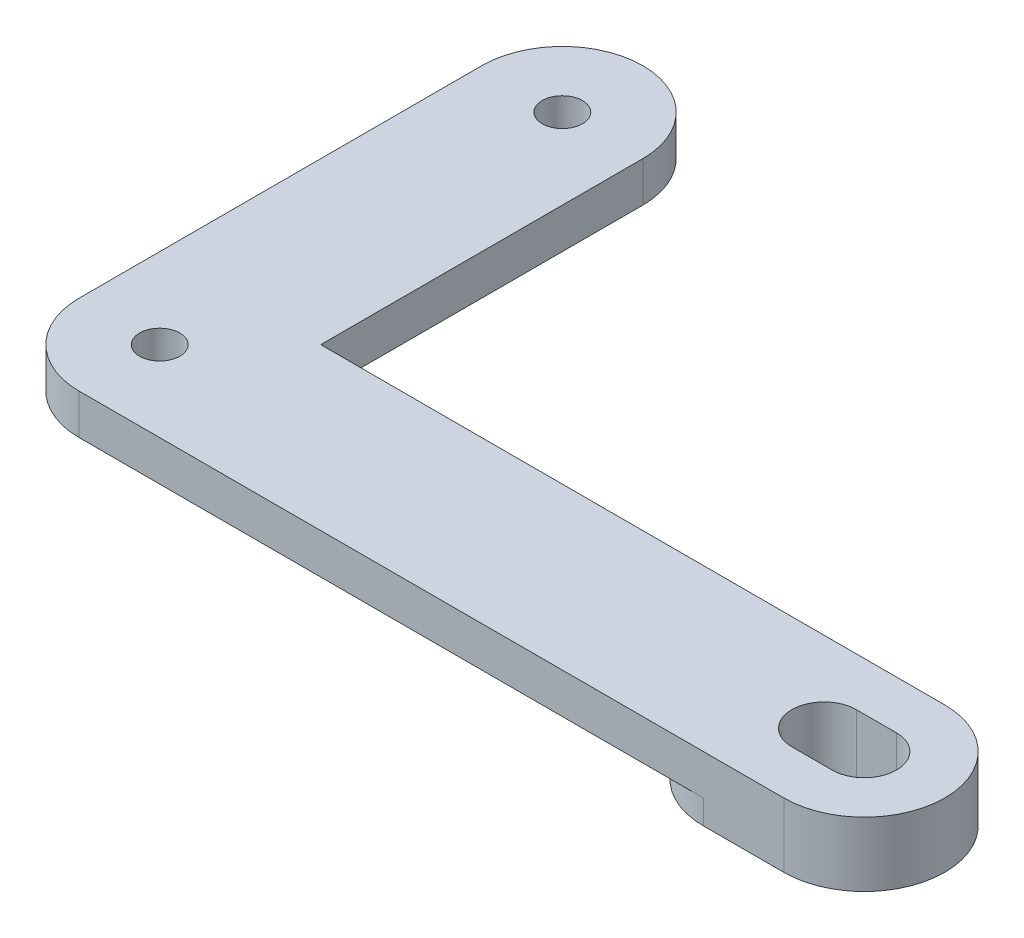
ISO-10303-21;
HEADER;
FILE_DESCRIPTION(('STEP AP214'),'2;1');
FILE_NAME('part.step','',(''),(''),'','','');
FILE_SCHEMA(('AUTOMOTIVE_DESIGN { 1 0 10303 214 1 1 1 1 }'));
ENDSEC;
DATA;
#1=APPLICATION_CONTEXT('core data for automotive mechanical design processes');
#2=APPLICATION_PROTOCOL_DEFINITION('international standard','automotive_design',2000,#1);
#3=PRODUCT_CONTEXT('',#1,'mechanical');
#4=PRODUCT('Part','Part','',(#3));
#5=PRODUCT_RELATED_PRODUCT_CATEGORY('part','',(#4));
#6=PRODUCT_DEFINITION_FORMATION('','',#4);
#7=PRODUCT_DEFINITION_CONTEXT('part definition',#1,'design');
#8=PRODUCT_DEFINITION('design','',#6,#7);
#9=PRODUCT_DEFINITION_SHAPE('','',#8);
#10=(LENGTH_UNIT() NAMED_UNIT(*) SI_UNIT(.MILLI.,.METRE.));
#11=(NAMED_UNIT(*) PLANE_ANGLE_UNIT() SI_UNIT($,.RADIAN.));
#12=(NAMED_UNIT(*) SI_UNIT($,.STERADIAN.) SOLID_ANGLE_UNIT());
#13=UNCERTAINTY_MEASURE_WITH_UNIT(LENGTH_MEASURE(1.E-05),#10,'distance_accuracy_value','');
#14=(GEOMETRIC_REPRESENTATION_CONTEXT(3) GLOBAL_UNCERTAINTY_ASSIGNED_CONTEXT((#13)) GLOBAL_UNIT_ASSIGNED_CONTEXT((#10,
#11,#12)) REPRESENTATION_CONTEXT('',''));
#15=CARTESIAN_POINT('',(0.,0.,0.));
#16=DIRECTION('',(0.,0.,1.));
#17=DIRECTION('',(1.,0.,0.));
#18=AXIS2_PLACEMENT_3D('',#15,#16,#17);
#19=CARTESIAN_POINT('',(0.,0.,0.));
#20=DIRECTION('',(0.,1.,0.));
#21=DIRECTION('',(0.,0.,1.));
#22=AXIS2_PLACEMENT_3D('',#19,#20,#21);
#23=PLANE('',#22);
#24=CARTESIAN_POINT('',(87.5,0.,0.));
#25=DIRECTION('',(0.,1.,0.));
#26=DIRECTION('',(0.,0.,1.));
#27=AXIS2_PLACEMENT_3D('',#24,#25,#26);
#28=CIRCLE('',#27,4.);
#29=CARTESIAN_POINT('',(87.5,0.,4.));
#30=VERTEX_POINT('',#29);
#31=CARTESIAN_POINT('',(87.5,0.,-4.));
#32=VERTEX_POINT('',#31);
#33=EDGE_CURVE('E56',#30,#32,#28,.T.);
#34=ORIENTED_EDGE('',*,*,#33,.T.);
#35=DIRECTION('',(-1.,0.,0.));
#36=VECTOR('',#35,1.);
#37=CARTESIAN_POINT('',(87.5,0.,-4.));
#38=LINE('',#37,#36);
#39=CARTESIAN_POINT('',(82.5,0.,-4.));
#40=VERTEX_POINT('',#39);
#41=EDGE_CURVE('E205',#32,#40,#38,.T.);
#42=ORIENTED_EDGE('',*,*,#41,.T.);
#43=CARTESIAN_POINT('',(82.5,0.,0.));
#44=DIRECTION('',(0.,1.,0.));
#45=DIRECTION('',(0.,0.,1.));
#46=AXIS2_PLACEMENT_3D('',#43,#44,#45);
#47=CIRCLE('',#46,4.);
#48=CARTESIAN_POINT('',(82.5,0.,4.));
#49=VERTEX_POINT('',#48);
#50=EDGE_CURVE('E208',#40,#49,#47,.T.);
#51=ORIENTED_EDGE('',*,*,#50,.T.);
#52=DIRECTION('',(1.,0.,0.));
#53=VECTOR('',#52,1.);
#54=CARTESIAN_POINT('',(87.5,0.,4.));
#55=LINE('',#54,#53);
#56=EDGE_CURVE('E197',#49,#30,#55,.T.);
#57=ORIENTED_EDGE('',*,*,#56,.T.);
#58=EDGE_LOOP('',(#34,#42,#51,#57));
#59=FACE_BOUND('',#58,.T.);
#60=CARTESIAN_POINT('',(77.5,0.,0.));
#61=DIRECTION('',(0.,-1.,0.));
#62=DIRECTION('',(0.,0.,-1.));
#63=AXIS2_PLACEMENT_3D('',#60,#61,#62);
#64=CIRCLE('',#63,10.);
#65=CARTESIAN_POINT('',(77.5,0.,10.));
#66=VERTEX_POINT('',#65);
#67=CARTESIAN_POINT('',(77.5,0.,-10.));
#68=VERTEX_POINT('',#67);
#69=EDGE_CURVE('E151',#66,#68,#64,.T.);
#70=ORIENTED_EDGE('',*,*,#69,.T.);
#71=DIRECTION('',(-1.,0.,0.));
#72=VECTOR('',#71,1.);
#73=CARTESIAN_POINT('',(0.,0.,-10.));
#74=LINE('',#73,#72);
#75=CARTESIAN_POINT('',(87.5,0.,-10.));
#76=VERTEX_POINT('',#75);
#77=EDGE_CURVE('E156',#76,#68,#74,.T.);
#78=ORIENTED_EDGE('',*,*,#77,.F.);
#79=CARTESIAN_POINT('',(87.5,0.,0.));
#80=DIRECTION('',(0.,1.,0.));
#81=DIRECTION('',(0.,0.,1.));
#82=AXIS2_PLACEMENT_3D('',#79,#80,#81);
#83=CIRCLE('',#82,10.);
#84=CARTESIAN_POINT('',(87.5,0.,10.));
#85=VERTEX_POINT('',#84);
#86=EDGE_CURVE('E235',#85,#76,#83,.T.);
#87=ORIENTED_EDGE('',*,*,#86,.F.);
#88=DIRECTION('',(1.,0.,0.));
#89=VECTOR('',#88,1.);
#90=CARTESIAN_POINT('',(0.,0.,10.));
#91=LINE('',#90,#89);
#92=EDGE_CURVE('E222',#66,#85,#91,.T.);
#93=ORIENTED_EDGE('',*,*,#92,.F.);
#94=EDGE_LOOP('',(#70,#78,#87,#93));
#95=FACE_BOUND('',#94,.T.);
#96=ADVANCED_FACE('F33',(#59,#95),#23,.F.);
#97=CARTESIAN_POINT('',(0.,8.,0.));
#98=DIRECTION('',(0.,1.,0.));
#99=DIRECTION('',(0.,0.,1.));
#100=AXIS2_PLACEMENT_3D('',#97,#98,#99);
#101=PLANE('',#100);
#102=CARTESIAN_POINT('',(0.,8.,0.));
#103=DIRECTION('',(0.,1.,0.));
#104=DIRECTION('',(0.,0.,1.));
#105=AXIS2_PLACEMENT_3D('',#102,#103,#104);
#106=CIRCLE('',#105,10.);
#107=CARTESIAN_POINT('',(-10.,8.,0.));
#108=VERTEX_POINT('',#107);
#109=CARTESIAN_POINT('',(0.,8.,10.));
#110=VERTEX_POINT('',#109);
#111=EDGE_CURVE('E223',#108,#110,#106,.T.);
#112=ORIENTED_EDGE('',*,*,#111,.T.);
#113=DIRECTION('',(1.,0.,0.));
#114=VECTOR('',#113,1.);
#115=CARTESIAN_POINT('',(0.,8.,10.));
#116=LINE('',#115,#114);
#117=CARTESIAN_POINT('',(87.5,8.,10.));
#118=VERTEX_POINT('',#117);
#119=EDGE_CURVE('E225',#110,#118,#116,.T.);
#120=ORIENTED_EDGE('',*,*,#119,.T.);
#121=CARTESIAN_POINT('',(87.5,8.,0.));
#122=DIRECTION('',(0.,1.,0.));
#123=DIRECTION('',(0.,0.,1.));
#124=AXIS2_PLACEMENT_3D('',#121,#122,#123);
#125=CIRCLE('',#124,10.);
#126=CARTESIAN_POINT('',(87.5,8.,-10.));
#127=VERTEX_POINT('',#126);
#128=EDGE_CURVE('E227',#118,#127,#125,.T.);
#129=ORIENTED_EDGE('',*,*,#128,.T.);
#130=DIRECTION('',(-1.,0.,0.));
#131=VECTOR('',#130,1.);
#132=CARTESIAN_POINT('',(0.,8.,-10.));
#133=LINE('',#132,#131);
#134=CARTESIAN_POINT('',(10.,8.,-10.));
#135=VERTEX_POINT('',#134);
#136=EDGE_CURVE('E229',#127,#135,#133,.T.);
#137=ORIENTED_EDGE('',*,*,#136,.T.);
#138=DIRECTION('',(0.,0.,-1.));
#139=VECTOR('',#138,1.);
#140=CARTESIAN_POINT('',(10.,8.,0.));
#141=LINE('',#140,#139);
#142=CARTESIAN_POINT('',(10.,8.,-50.));
#143=VERTEX_POINT('',#142);
#144=EDGE_CURVE('E170',#135,#143,#141,.T.);
#145=ORIENTED_EDGE('',*,*,#144,.T.);
#146=CARTESIAN_POINT('',(0.,8.,-50.));
#147=DIRECTION('',(0.,1.,0.));
#148=DIRECTION('',(0.,0.,1.));
#149=AXIS2_PLACEMENT_3D('',#146,#147,#148);
#150=CIRCLE('',#149,10.);
#151=CARTESIAN_POINT('',(-10.,8.,-50.));
#152=VERTEX_POINT('',#151);
#153=EDGE_CURVE('E183',#143,#152,#150,.T.);
#154=ORIENTED_EDGE('',*,*,#153,.T.);
#155=DIRECTION('',(0.,0.,1.));
#156=VECTOR('',#155,1.);
#157=CARTESIAN_POINT('',(-10.,8.,0.));
#158=LINE('',#157,#156);
#159=EDGE_CURVE('E175',#152,#108,#158,.T.);
#160=ORIENTED_EDGE('',*,*,#159,.T.);
#161=EDGE_LOOP('',(#112,#120,#129,#137,#145,#154,#160));
#162=FACE_BOUND('',#161,.T.);
#163=DIRECTION('',(-1.,0.,0.));
#164=VECTOR('',#163,1.);
#165=CARTESIAN_POINT('',(87.5,8.,-4.));
#166=LINE('',#165,#164);
#167=CARTESIAN_POINT('',(87.5,8.,-4.));
#168=VERTEX_POINT('',#167);
#169=CARTESIAN_POINT('',(82.5,8.,-4.));
#170=VERTEX_POINT('',#169);
#171=EDGE_CURVE('E196',#168,#170,#166,.T.);
#172=ORIENTED_EDGE('',*,*,#171,.F.);
#173=CARTESIAN_POINT('',(87.5,8.,0.));
#174=DIRECTION('',(0.,1.,0.));
#175=DIRECTION('',(0.,0.,1.));
#176=AXIS2_PLACEMENT_3D('',#173,#174,#175);
#177=CIRCLE('',#176,4.);
#178=CARTESIAN_POINT('',(87.5,8.,4.));
#179=VERTEX_POINT('',#178);
#180=EDGE_CURVE('E194',#179,#168,#177,.T.);
#181=ORIENTED_EDGE('',*,*,#180,.F.);
#182=DIRECTION('',(1.,0.,0.));
#183=VECTOR('',#182,1.);
#184=CARTESIAN_POINT('',(87.5,8.,4.));
#185=LINE('',#184,#183);
#186=CARTESIAN_POINT('',(82.5,8.,4.));
#187=VERTEX_POINT('',#186);
#188=EDGE_CURVE('E201',#187,#179,#185,.T.);
#189=ORIENTED_EDGE('',*,*,#188,.F.);
#190=CARTESIAN_POINT('',(82.5,8.,0.));
#191=DIRECTION('',(0.,1.,0.));
#192=DIRECTION('',(0.,0.,1.));
#193=AXIS2_PLACEMENT_3D('',#190,#191,#192);
#194=CIRCLE('',#193,4.);
#195=EDGE_CURVE('E199',#170,#187,#194,.T.);
#196=ORIENTED_EDGE('',*,*,#195,.F.);
#197=EDGE_LOOP('',(#172,#181,#189,#196));
#198=FACE_BOUND('',#197,.T.);
#199=CARTESIAN_POINT('',(0.,8.,0.));
#200=DIRECTION('',(0.,1.,0.));
#201=DIRECTION('',(0.,0.,1.));
#202=AXIS2_PLACEMENT_3D('',#199,#200,#201);
#203=CIRCLE('',#202,2.5);
#204=CARTESIAN_POINT('',(0.,8.,2.5));
#205=VERTEX_POINT('',#204);
#206=EDGE_CURVE('E219',#205,#205,#203,.T.);
#207=ORIENTED_EDGE('',*,*,#206,.F.);
#208=EDGE_LOOP('',(#207));
#209=FACE_BOUND('',#208,.T.);
#210=CARTESIAN_POINT('',(0.,8.,-50.));
#211=DIRECTION('',(0.,1.,0.));
#212=DIRECTION('',(0.,0.,1.));
#213=AXIS2_PLACEMENT_3D('',#210,#211,#212);
#214=CIRCLE('',#213,2.5);
#215=CARTESIAN_POINT('',(0.,8.,-47.5));
#216=VERTEX_POINT('',#215);
#217=EDGE_CURVE('E141',#216,#216,#214,.T.);
#218=ORIENTED_EDGE('',*,*,#217,.F.);
#219=EDGE_LOOP('',(#218));
#220=FACE_BOUND('',#219,.T.);
#221=ADVANCED_FACE('F262',(#162,#198,#209,#220),#101,.T.);
#222=CARTESIAN_POINT('',(0.,8.,0.));
#223=DIRECTION('',(0.,-1.,0.));
#224=DIRECTION('',(0.,0.,-1.));
#225=AXIS2_PLACEMENT_3D('',#222,#223,#224);
#226=CYLINDRICAL_SURFACE('',#225,10.);
#227=DIRECTION('',(0.,1.,0.));
#228=VECTOR('',#227,1.);
#229=CARTESIAN_POINT('',(-10.,3.,0.));
#230=LINE('',#229,#228);
#231=CARTESIAN_POINT('',(-10.,3.,0.));
#232=VERTEX_POINT('',#231);
#233=EDGE_CURVE('E188',#232,#108,#230,.T.);
#234=ORIENTED_EDGE('',*,*,#233,.F.);
#235=CARTESIAN_POINT('',(0.,3.,0.));
#236=DIRECTION('',(0.,1.,0.));
#237=DIRECTION('',(0.,0.,1.));
#238=AXIS2_PLACEMENT_3D('',#235,#236,#237);
#239=CIRCLE('',#238,10.);
#240=CARTESIAN_POINT('',(0.,3.,10.));
#241=VERTEX_POINT('',#240);
#242=EDGE_CURVE('E150',#232,#241,#239,.T.);
#243=ORIENTED_EDGE('',*,*,#242,.T.);
#244=DIRECTION('',(0.,-1.,0.));
#245=VECTOR('',#244,1.);
#246=CARTESIAN_POINT('',(0.,8.,10.));
#247=LINE('',#246,#245);
#248=EDGE_CURVE('E41',#110,#241,#247,.T.);
#249=ORIENTED_EDGE('',*,*,#248,.F.);
#250=ORIENTED_EDGE('',*,*,#111,.F.);
#251=EDGE_LOOP('',(#234,#243,#249,#250));
#252=FACE_BOUND('',#251,.T.);
#253=ADVANCED_FACE('F35',(#252),#226,.T.);
#254=CARTESIAN_POINT('',(0.,8.,10.));
#255=DIRECTION('',(0.,0.,-1.));
#256=DIRECTION('',(-1.,0.,0.));
#257=AXIS2_PLACEMENT_3D('',#254,#255,#256);
#258=PLANE('',#257);
#259=ORIENTED_EDGE('',*,*,#248,.T.);
#260=DIRECTION('',(1.,0.,0.));
#261=VECTOR('',#260,1.);
#262=CARTESIAN_POINT('',(0.,3.,10.));
#263=LINE('',#262,#261);
#264=CARTESIAN_POINT('',(77.5,3.,10.));
#265=VERTEX_POINT('',#264);
#266=EDGE_CURVE('E163',#241,#265,#263,.T.);
#267=ORIENTED_EDGE('',*,*,#266,.T.);
#268=DIRECTION('',(0.,-1.,0.));
#269=VECTOR('',#268,1.);
#270=CARTESIAN_POINT('',(77.5,132.95505890483,10.));
#271=LINE('',#270,#269);
#272=EDGE_CURVE('E149',#265,#66,#271,.T.);
#273=ORIENTED_EDGE('',*,*,#272,.T.);
#274=ORIENTED_EDGE('',*,*,#92,.T.);
#275=DIRECTION('',(0.,-1.,0.));
#276=VECTOR('',#275,1.);
#277=CARTESIAN_POINT('',(87.5,8.,10.));
#278=LINE('',#277,#276);
#279=EDGE_CURVE('E240',#118,#85,#278,.T.);
#280=ORIENTED_EDGE('',*,*,#279,.F.);
#281=ORIENTED_EDGE('',*,*,#119,.F.);
#282=EDGE_LOOP('',(#259,#267,#273,#274,#280,#281));
#283=FACE_BOUND('',#282,.T.);
#284=ADVANCED_FACE('F245',(#283),#258,.F.);
#285=CARTESIAN_POINT('',(87.5,8.,0.));
#286=DIRECTION('',(0.,-1.,0.));
#287=DIRECTION('',(0.,0.,-1.));
#288=AXIS2_PLACEMENT_3D('',#285,#286,#287);
#289=CYLINDRICAL_SURFACE('',#288,10.);
#290=ORIENTED_EDGE('',*,*,#279,.T.);
#291=ORIENTED_EDGE('',*,*,#86,.T.);
#292=DIRECTION('',(0.,-1.,0.));
#293=VECTOR('',#292,1.);
#294=CARTESIAN_POINT('',(87.5,8.,-10.));
#295=LINE('',#294,#293);
#296=EDGE_CURVE('E232',#127,#76,#295,.T.);
#297=ORIENTED_EDGE('',*,*,#296,.F.);
#298=ORIENTED_EDGE('',*,*,#128,.F.);
#299=EDGE_LOOP('',(#290,#291,#297,#298));
#300=FACE_BOUND('',#299,.T.);
#301=ADVANCED_FACE('F267',(#300),#289,.T.);
#302=CARTESIAN_POINT('',(0.,8.,-10.));
#303=DIRECTION('',(0.,0.,1.));
#304=DIRECTION('',(1.,0.,0.));
#305=AXIS2_PLACEMENT_3D('',#302,#303,#304);
#306=PLANE('',#305);
#307=ORIENTED_EDGE('',*,*,#296,.T.);
#308=ORIENTED_EDGE('',*,*,#77,.T.);
#309=DIRECTION('',(0.,-1.,0.));
#310=VECTOR('',#309,1.);
#311=CARTESIAN_POINT('',(77.5,132.95505890483,-10.));
#312=LINE('',#311,#310);
#313=CARTESIAN_POINT('',(77.5,3.,-10.));
#314=VERTEX_POINT('',#313);
#315=EDGE_CURVE('E146',#314,#68,#312,.T.);
#316=ORIENTED_EDGE('',*,*,#315,.F.);
#317=DIRECTION('',(-1.,0.,0.));
#318=VECTOR('',#317,1.);
#319=CARTESIAN_POINT('',(0.,3.,-10.));
#320=LINE('',#319,#318);
#321=CARTESIAN_POINT('',(10.,3.,-10.));
#322=VERTEX_POINT('',#321);
#323=EDGE_CURVE('E130',#314,#322,#320,.T.);
#324=ORIENTED_EDGE('',*,*,#323,.T.);
#325=DIRECTION('',(0.,1.,0.));
#326=VECTOR('',#325,1.);
#327=CARTESIAN_POINT('',(10.,8.,-10.));
#328=LINE('',#327,#326);
#329=EDGE_CURVE('E12',#322,#135,#328,.T.);
#330=ORIENTED_EDGE('',*,*,#329,.T.);
#331=ORIENTED_EDGE('',*,*,#136,.F.);
#332=EDGE_LOOP('',(#307,#308,#316,#324,#330,#331));
#333=FACE_BOUND('',#332,.T.);
#334=ADVANCED_FACE('F154',(#333),#306,.F.);
#335=CARTESIAN_POINT('',(0.,8.,0.));
#336=DIRECTION('',(0.,-1.,0.));
#337=DIRECTION('',(0.,0.,-1.));
#338=AXIS2_PLACEMENT_3D('',#335,#336,#337);
#339=CYLINDRICAL_SURFACE('',#338,2.5);
#340=CARTESIAN_POINT('',(0.,3.,0.));
#341=DIRECTION('',(0.,1.,0.));
#342=DIRECTION('',(0.,0.,1.));
#343=AXIS2_PLACEMENT_3D('',#340,#341,#342);
#344=CIRCLE('',#343,2.5);
#345=CARTESIAN_POINT('',(0.,3.,2.5));
#346=VERTEX_POINT('',#345);
#347=EDGE_CURVE('E142',#346,#346,#344,.T.);
#348=ORIENTED_EDGE('',*,*,#347,.F.);
#349=EDGE_LOOP('',(#348));
#350=FACE_BOUND('',#349,.T.);
#351=ORIENTED_EDGE('',*,*,#206,.T.);
#352=EDGE_LOOP('',(#351));
#353=FACE_BOUND('',#352,.T.);
#354=ADVANCED_FACE('F282',(#350,#353),#339,.F.);
#355=CARTESIAN_POINT('',(87.5,8.,0.));
#356=DIRECTION('',(0.,-1.,0.));
#357=DIRECTION('',(0.,0.,-1.));
#358=AXIS2_PLACEMENT_3D('',#355,#356,#357);
#359=CYLINDRICAL_SURFACE('',#358,4.);
#360=ORIENTED_EDGE('',*,*,#33,.F.);
#361=DIRECTION('',(0.,-1.,0.));
#362=VECTOR('',#361,1.);
#363=CARTESIAN_POINT('',(87.5,8.,4.));
#364=LINE('',#363,#362);
#365=EDGE_CURVE('E203',#179,#30,#364,.T.);
#366=ORIENTED_EDGE('',*,*,#365,.F.);
#367=ORIENTED_EDGE('',*,*,#180,.T.);
#368=DIRECTION('',(0.,-1.,0.));
#369=VECTOR('',#368,1.);
#370=CARTESIAN_POINT('',(87.5,8.,-4.));
#371=LINE('',#370,#369);
#372=EDGE_CURVE('E217',#168,#32,#371,.T.);
#373=ORIENTED_EDGE('',*,*,#372,.T.);
#374=EDGE_LOOP('',(#360,#366,#367,#373));
#375=FACE_BOUND('',#374,.T.);
#376=ADVANCED_FACE('F375',(#375),#359,.F.);
#377=CARTESIAN_POINT('',(87.5,8.,-4.));
#378=DIRECTION('',(0.,0.,1.));
#379=DIRECTION('',(1.,0.,0.));
#380=AXIS2_PLACEMENT_3D('',#377,#378,#379);
#381=PLANE('',#380);
#382=ORIENTED_EDGE('',*,*,#41,.F.);
#383=ORIENTED_EDGE('',*,*,#372,.F.);
#384=ORIENTED_EDGE('',*,*,#171,.T.);
#385=DIRECTION('',(0.,-1.,0.));
#386=VECTOR('',#385,1.);
#387=CARTESIAN_POINT('',(82.5,8.,-4.));
#388=LINE('',#387,#386);
#389=EDGE_CURVE('E215',#170,#40,#388,.T.);
#390=ORIENTED_EDGE('',*,*,#389,.T.);
#391=EDGE_LOOP('',(#382,#383,#384,#390));
#392=FACE_BOUND('',#391,.T.);
#393=ADVANCED_FACE('F367',(#392),#381,.T.);
#394=CARTESIAN_POINT('',(82.5,8.,0.));
#395=DIRECTION('',(0.,-1.,0.));
#396=DIRECTION('',(0.,0.,-1.));
#397=AXIS2_PLACEMENT_3D('',#394,#395,#396);
#398=CYLINDRICAL_SURFACE('',#397,4.);
#399=ORIENTED_EDGE('',*,*,#50,.F.);
#400=ORIENTED_EDGE('',*,*,#389,.F.);
#401=ORIENTED_EDGE('',*,*,#195,.T.);
#402=DIRECTION('',(0.,-1.,0.));
#403=VECTOR('',#402,1.);
#404=CARTESIAN_POINT('',(82.5,8.,4.));
#405=LINE('',#404,#403);
#406=EDGE_CURVE('E48',#187,#49,#405,.T.);
#407=ORIENTED_EDGE('',*,*,#406,.T.);
#408=EDGE_LOOP('',(#399,#400,#401,#407));
#409=FACE_BOUND('',#408,.T.);
#410=ADVANCED_FACE('F363',(#409),#398,.F.);
#411=CARTESIAN_POINT('',(87.5,8.,4.));
#412=DIRECTION('',(0.,0.,-1.));
#413=DIRECTION('',(-1.,0.,0.));
#414=AXIS2_PLACEMENT_3D('',#411,#412,#413);
#415=PLANE('',#414);
#416=ORIENTED_EDGE('',*,*,#56,.F.);
#417=ORIENTED_EDGE('',*,*,#406,.F.);
#418=ORIENTED_EDGE('',*,*,#188,.T.);
#419=ORIENTED_EDGE('',*,*,#365,.T.);
#420=EDGE_LOOP('',(#416,#417,#418,#419));
#421=FACE_BOUND('',#420,.T.);
#422=ADVANCED_FACE('F303',(#421),#415,.T.);
#423=CARTESIAN_POINT('',(10.,3.,0.));
#424=DIRECTION('',(1.,0.,0.));
#425=DIRECTION('',(0.,0.,-1.));
#426=AXIS2_PLACEMENT_3D('',#423,#424,#425);
#427=PLANE('',#426);
#428=ORIENTED_EDGE('',*,*,#329,.F.);
#429=DIRECTION('',(0.,0.,-1.));
#430=VECTOR('',#429,1.);
#431=CARTESIAN_POINT('',(10.,3.,0.));
#432=LINE('',#431,#430);
#433=CARTESIAN_POINT('',(10.,3.,-50.));
#434=VERTEX_POINT('',#433);
#435=EDGE_CURVE('E137',#322,#434,#432,.T.);
#436=ORIENTED_EDGE('',*,*,#435,.T.);
#437=DIRECTION('',(0.,1.,0.));
#438=VECTOR('',#437,1.);
#439=CARTESIAN_POINT('',(10.,3.,-50.));
#440=LINE('',#439,#438);
#441=EDGE_CURVE('E181',#434,#143,#440,.T.);
#442=ORIENTED_EDGE('',*,*,#441,.T.);
#443=ORIENTED_EDGE('',*,*,#144,.F.);
#444=EDGE_LOOP('',(#428,#436,#442,#443));
#445=FACE_BOUND('',#444,.T.);
#446=ADVANCED_FACE('F259',(#445),#427,.T.);
#447=CARTESIAN_POINT('',(0.,3.,0.));
#448=DIRECTION('',(0.,1.,0.));
#449=DIRECTION('',(0.,0.,1.));
#450=AXIS2_PLACEMENT_3D('',#447,#448,#449);
#451=PLANE('',#450);
#452=ORIENTED_EDGE('',*,*,#242,.F.);
#453=DIRECTION('',(0.,0.,1.));
#454=VECTOR('',#453,1.);
#455=CARTESIAN_POINT('',(-10.,3.,0.));
#456=LINE('',#455,#454);
#457=CARTESIAN_POINT('',(-10.,3.,-50.));
#458=VERTEX_POINT('',#457);
#459=EDGE_CURVE('E178',#458,#232,#456,.T.);
#460=ORIENTED_EDGE('',*,*,#459,.F.);
#461=CARTESIAN_POINT('',(0.,3.,-50.));
#462=DIRECTION('',(0.,1.,0.));
#463=DIRECTION('',(0.,0.,1.));
#464=AXIS2_PLACEMENT_3D('',#461,#462,#463);
#465=CIRCLE('',#464,10.);
#466=EDGE_CURVE('E174',#434,#458,#465,.T.);
#467=ORIENTED_EDGE('',*,*,#466,.F.);
#468=ORIENTED_EDGE('',*,*,#435,.F.);
#469=ORIENTED_EDGE('',*,*,#323,.F.);
#470=CARTESIAN_POINT('',(77.5,3.,0.));
#471=DIRECTION('',(0.,1.,0.));
#472=DIRECTION('',(0.,0.,1.));
#473=AXIS2_PLACEMENT_3D('',#470,#471,#472);
#474=CIRCLE('',#473,10.);
#475=EDGE_CURVE('E134',#265,#314,#474,.F.);
#476=ORIENTED_EDGE('',*,*,#475,.F.);
#477=ORIENTED_EDGE('',*,*,#266,.F.);
#478=EDGE_LOOP('',(#452,#460,#467,#468,#469,#476,#477));
#479=FACE_BOUND('',#478,.T.);
#480=CARTESIAN_POINT('',(0.,3.,-50.));
#481=DIRECTION('',(0.,1.,0.));
#482=DIRECTION('',(0.,0.,1.));
#483=AXIS2_PLACEMENT_3D('',#480,#481,#482);
#484=CIRCLE('',#483,2.5);
#485=CARTESIAN_POINT('',(0.,3.,-47.5));
#486=VERTEX_POINT('',#485);
#487=EDGE_CURVE('E167',#486,#486,#484,.T.);
#488=ORIENTED_EDGE('',*,*,#487,.T.);
#489=EDGE_LOOP('',(#488));
#490=FACE_BOUND('',#489,.T.);
#491=ORIENTED_EDGE('',*,*,#347,.T.);
#492=EDGE_LOOP('',(#491));
#493=FACE_BOUND('',#492,.T.);
#494=ADVANCED_FACE('F132',(#479,#490,#493),#451,.F.);
#495=CARTESIAN_POINT('',(-10.,3.,0.));
#496=DIRECTION('',(-1.,0.,0.));
#497=DIRECTION('',(0.,0.,1.));
#498=AXIS2_PLACEMENT_3D('',#495,#496,#497);
#499=PLANE('',#498);
#500=ORIENTED_EDGE('',*,*,#159,.F.);
#501=DIRECTION('',(0.,1.,0.));
#502=VECTOR('',#501,1.);
#503=CARTESIAN_POINT('',(-10.,3.,-50.));
#504=LINE('',#503,#502);
#505=EDGE_CURVE('E190',#458,#152,#504,.T.);
#506=ORIENTED_EDGE('',*,*,#505,.F.);
#507=ORIENTED_EDGE('',*,*,#459,.T.);
#508=ORIENTED_EDGE('',*,*,#233,.T.);
#509=EDGE_LOOP('',(#500,#506,#507,#508));
#510=FACE_BOUND('',#509,.T.);
#511=ADVANCED_FACE('F253',(#510),#499,.T.);
#512=CARTESIAN_POINT('',(0.,3.,-50.));
#513=DIRECTION('',(0.,1.,0.));
#514=DIRECTION('',(0.,0.,1.));
#515=AXIS2_PLACEMENT_3D('',#512,#513,#514);
#516=CYLINDRICAL_SURFACE('',#515,10.);
#517=ORIENTED_EDGE('',*,*,#153,.F.);
#518=ORIENTED_EDGE('',*,*,#441,.F.);
#519=ORIENTED_EDGE('',*,*,#466,.T.);
#520=ORIENTED_EDGE('',*,*,#505,.T.);
#521=EDGE_LOOP('',(#517,#518,#519,#520));
#522=FACE_BOUND('',#521,.T.);
#523=ADVANCED_FACE('F257',(#522),#516,.T.);
#524=CARTESIAN_POINT('',(0.,3.,-50.));
#525=DIRECTION('',(0.,1.,0.));
#526=DIRECTION('',(0.,0.,1.));
#527=AXIS2_PLACEMENT_3D('',#524,#525,#526);
#528=CYLINDRICAL_SURFACE('',#527,2.5);
#529=ORIENTED_EDGE('',*,*,#487,.F.);
#530=EDGE_LOOP('',(#529));
#531=FACE_BOUND('',#530,.T.);
#532=ORIENTED_EDGE('',*,*,#217,.T.);
#533=EDGE_LOOP('',(#532));
#534=FACE_BOUND('',#533,.T.);
#535=ADVANCED_FACE('F311',(#531,#534),#528,.F.);
#536=CARTESIAN_POINT('',(77.5,132.95505890483,0.));
#537=DIRECTION('',(0.,-1.,0.));
#538=DIRECTION('',(0.,0.,-1.));
#539=AXIS2_PLACEMENT_3D('',#536,#537,#538);
#540=CYLINDRICAL_SURFACE('',#539,10.);
#541=ORIENTED_EDGE('',*,*,#475,.T.);
#542=ORIENTED_EDGE('',*,*,#315,.T.);
#543=ORIENTED_EDGE('',*,*,#69,.F.);
#544=ORIENTED_EDGE('',*,*,#272,.F.);
#545=EDGE_LOOP('',(#541,#542,#543,#544));
#546=FACE_BOUND('',#545,.T.);
#547=ADVANCED_FACE('F145',(#546),#540,.T.);
#548=CLOSED_SHELL('',(#96,#221,#253,#284,#301,#334,#354,#376,#393,#410,#422,#446,#494,#511,#523,
#535,#547));
#549=MANIFOLD_SOLID_BREP('B2',#548);
#550=ADVANCED_BREP_SHAPE_REPRESENTATION('',(#18,#549),#14);
#551=SHAPE_DEFINITION_REPRESENTATION(#9,#550);
ENDSEC;
END-ISO-10303-21;
